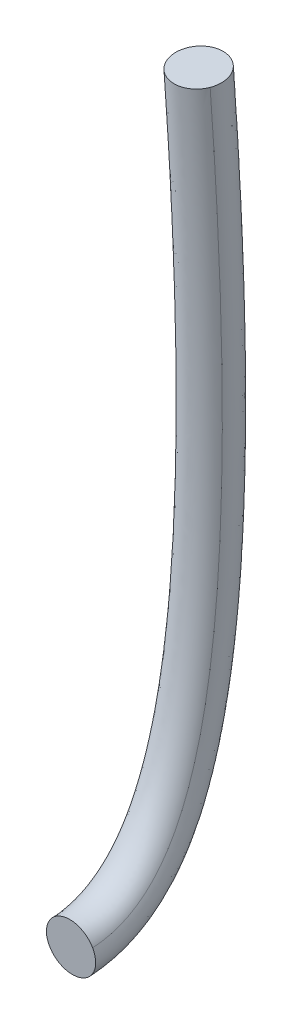
ISO-10303-21;
HEADER;
FILE_DESCRIPTION(('STEP AP214'),'2;1');
FILE_NAME('part.step','',(''),(''),'','','');
FILE_SCHEMA(('AUTOMOTIVE_DESIGN { 1 0 10303 214 1 1 1 1 }'));
ENDSEC;
DATA;
#1=APPLICATION_CONTEXT('core data for automotive mechanical design processes');
#2=APPLICATION_PROTOCOL_DEFINITION('international standard','automotive_design',2000,#1);
#3=PRODUCT_CONTEXT('',#1,'mechanical');
#4=PRODUCT('Part','Part','',(#3));
#5=PRODUCT_RELATED_PRODUCT_CATEGORY('part','',(#4));
#6=PRODUCT_DEFINITION_FORMATION('','',#4);
#7=PRODUCT_DEFINITION_CONTEXT('part definition',#1,'design');
#8=PRODUCT_DEFINITION('design','',#6,#7);
#9=PRODUCT_DEFINITION_SHAPE('','',#8);
#10=(LENGTH_UNIT() NAMED_UNIT(*) SI_UNIT(.MILLI.,.METRE.));
#11=(NAMED_UNIT(*) PLANE_ANGLE_UNIT() SI_UNIT($,.RADIAN.));
#12=(NAMED_UNIT(*) SI_UNIT($,.STERADIAN.) SOLID_ANGLE_UNIT());
#13=UNCERTAINTY_MEASURE_WITH_UNIT(LENGTH_MEASURE(1.E-05),#10,'distance_accuracy_value','');
#14=(GEOMETRIC_REPRESENTATION_CONTEXT(3) GLOBAL_UNCERTAINTY_ASSIGNED_CONTEXT((#13)) GLOBAL_UNIT_ASSIGNED_CONTEXT((#10,
#11,#12)) REPRESENTATION_CONTEXT('',''));
#15=CARTESIAN_POINT('',(0.,0.,0.));
#16=DIRECTION('',(0.,0.,1.));
#17=DIRECTION('',(1.,0.,0.));
#18=AXIS2_PLACEMENT_3D('',#15,#16,#17);
#19=CARTESIAN_POINT('',(19.2528947770719,-7.28816584731892,11.1726700992459));
#20=CARTESIAN_POINT('',(19.2528947770721,-7.2797998774545,11.0210211891771));
#21=CARTESIAN_POINT('',(19.2528947770723,-7.19252148432578,10.7546354346372));
#22=CARTESIAN_POINT('',(19.2528947770722,-6.82521930482318,10.4241681519348));
#23=CARTESIAN_POINT('',(19.2528947770718,-6.16593652603589,10.177071260801));
#24=CARTESIAN_POINT('',(19.2528947770714,-5.06042734487226,10.0061121195369));
#25=CARTESIAN_POINT('',(19.252894777071,-3.38310094063414,9.96220381229288));
#26=CARTESIAN_POINT('',(19.2528947770715,-1.84086867484102,10.0365189792936));
#27=CARTESIAN_POINT('',(19.2528947770719,-1.00711457101815,10.0974125590462));
#28=CARTESIAN_POINT('',(19.2237950641936,-7.22780268296444,11.1760001357999));
#29=CARTESIAN_POINT('',(19.2237950641938,-7.21998990173285,11.0343788082579));
#30=CARTESIAN_POINT('',(19.223795064194,-7.14066275815899,10.7916659537891));
#31=CARTESIAN_POINT('',(19.223795064194,-6.7971941131337,10.4792308251784));
#32=CARTESIAN_POINT('',(19.2237950641935,-6.152759146217,10.2363764894985));
#33=CARTESIAN_POINT('',(19.2237950641931,-5.05673501634292,10.0666901080208));
#34=CARTESIAN_POINT('',(19.2237950641927,-3.38440386039866,10.0226639554543));
#35=CARTESIAN_POINT('',(19.2237950641932,-1.84433189825577,10.0968820135693));
#36=CARTESIAN_POINT('',(19.2237950641937,-1.01151819422325,10.1577069108298));
#37=CARTESIAN_POINT('',(19.1072924405877,-7.13476627183315,11.1811326475433));
#38=CARTESIAN_POINT('',(19.1072924405879,-7.12780570260208,11.0549592624543));
#39=CARTESIAN_POINT('',(19.107292440588,-7.06073942932499,10.8487309055416));
#40=CARTESIAN_POINT('',(19.107292440588,-6.75399421305741,10.5640804815241));
#41=CARTESIAN_POINT('',(19.1072924405875,-6.13244240560903,10.3277713970417));
#42=CARTESIAN_POINT('',(19.1072924405871,-5.05103829187187,10.1600503561438));
#43=CARTESIAN_POINT('',(19.1072924405868,-3.38640664882599,10.1158458533863));
#44=CARTESIAN_POINT('',(19.1072924405872,-1.84967037715123,10.1899181738779));
#45=CARTESIAN_POINT('',(19.1072924405876,-1.01830540134462,10.2506372626664));
#46=CARTESIAN_POINT('',(18.8893955517359,-7.18477622453543,11.178373763506));
#47=CARTESIAN_POINT('',(18.8893955517361,-7.17735831437383,11.0439102154399));
#48=CARTESIAN_POINT('',(18.8893955517362,-7.10369074966388,10.8180740452729));
#49=CARTESIAN_POINT('',(18.8893955517362,-6.77722527891507,10.5185030039011));
#50=CARTESIAN_POINT('',(18.8893955517357,-6.14337573524482,10.2786640091069));
#51=CARTESIAN_POINT('',(18.8893955517353,-5.05411121634845,10.1098797636854));
#52=CARTESIAN_POINT('',(18.889395551735,-3.38534002015267,10.0657650624524));
#53=CARTESIAN_POINT('',(18.8893955517354,-1.8467995054108,10.1399084490463));
#54=CARTESIAN_POINT('',(18.8893955517359,-1.0146570672891,10.2006843201201));
#55=CARTESIAN_POINT('',(18.8250000000014,-7.31847179552639,11.1709982201049));
#56=CARTESIAN_POINT('',(18.8250000000016,-7.30982729388697,11.0143003987002));
#57=CARTESIAN_POINT('',(18.8250000000017,-7.21856827728348,10.7360254459493));
#58=CARTESIAN_POINT('',(18.8250000000017,-6.83927922884854,10.3964894765158));
#59=CARTESIAN_POINT('',(18.8250000000012,-6.17253911028429,10.14727495182));
#60=CARTESIAN_POINT('',(18.8250000000008,-5.06226966427635,9.9756840180992));
#61=CARTESIAN_POINT('',(18.8250000000005,-3.38243622395594,9.93184133465055));
#62=CARTESIAN_POINT('',(18.8250000000009,-1.83913128396928,10.00621299735));
#63=CARTESIAN_POINT('',(18.8250000000014,-1.00490368664486,10.0671411588984));
#64=CARTESIAN_POINT('',(18.825,-7.38568943191456,11.1672900449514));
#65=CARTESIAN_POINT('',(18.8250000000002,-7.37642950308164,10.9994364502612));
#66=CARTESIAN_POINT('',(18.8250000000004,-7.27630809150473,10.6948033284885));
#67=CARTESIAN_POINT('',(18.8250000000003,-6.87049433625223,10.3351987871578));
#68=CARTESIAN_POINT('',(18.8249999999999,-6.18722243949544,10.0812509721236));
#69=CARTESIAN_POINT('',(18.8249999999994,-5.06638957112934,9.90823752649242));
#70=CARTESIAN_POINT('',(18.8249999999991,-3.38099301503353,9.86452138941648));
#71=CARTESIAN_POINT('',(18.8249999999996,-1.83527381521949,9.93899557759439));
#72=CARTESIAN_POINT('',(18.825,-1.00000001490137,10.0000001490162));
#73=B_SPLINE_SURFACE_WITH_KNOTS('',3,3,((#19,#20,#21,#22,#23,#24,#25,#26,#27),(#28,#29,#30,#31,
#32,#33,#34,#35,#36),(#37,#38,#39,#40,#41,#42,#43,#44,#45),(#46,#47,#48,#49,#50,#51,#52,#53,
#54),(#55,#56,#57,#58,#59,#60,#61,#62,#63),(#64,#65,#66,#67,#68,#69,#70,#71,#72)),.UNSPECIFIED.,
.F.,.F.,.F.,(4,1,1,4),(4,1,1,1,1,1,4),(0.448798950512828,1.34639685153848,2.24399475256414,
3.14159265358979),(0.,0.142857142857143,0.285714285714286,0.428571428571429,0.571428571428571,
0.785714285714286,1.),.UNSPECIFIED.);
#74=CARTESIAN_POINT('',(18.825,-7.38568943191456,11.1672900449514));
#75=CARTESIAN_POINT('',(18.8250000000002,-7.37642950308164,10.9994364502612));
#76=CARTESIAN_POINT('',(18.8250000000004,-7.27630809150473,10.6948033284885));
#77=CARTESIAN_POINT('',(18.8250000000003,-6.87049433625223,10.3351987871578));
#78=CARTESIAN_POINT('',(18.8249999999999,-6.18722243949544,10.0812509721236));
#79=CARTESIAN_POINT('',(18.8249999999994,-5.06638957112934,9.90823752649242));
#80=CARTESIAN_POINT('',(18.8249999999991,-3.38099301503353,9.86452138941648));
#81=CARTESIAN_POINT('',(18.8249999999996,-1.83527381521949,9.93899557759439));
#82=CARTESIAN_POINT('',(18.825,-1.00000001490137,10.0000001490162));
#83=B_SPLINE_CURVE_WITH_KNOTS('',3,(#74,#75,#76,#77,#78,#79,#80,#81,#82),.UNSPECIFIED.,.F.,.F.,
(4,1,1,1,1,1,4),(0.,0.142857142857143,0.285714285714286,0.428571428571429,0.571428571428571,
0.785714285714286,1.),.UNSPECIFIED.);
#84=CARTESIAN_POINT('',(18.825,-7.38568943191456,11.1672900449514));
#85=VERTEX_POINT('',#84);
#86=CARTESIAN_POINT('',(18.825,-1.00000001490137,10.0000001490162));
#87=VERTEX_POINT('',#86);
#88=EDGE_CURVE('E11',#85,#87,#83,.T.);
#89=CARTESIAN_POINT('',(18.825,-7.38568943191456,11.1672900449514));
#90=CARTESIAN_POINT('',(18.8249787567478,-7.4110244281222,11.1658923968266));
#91=CARTESIAN_POINT('',(18.8294743987769,-7.4364319586651,11.1644907472219));
#92=CARTESIAN_POINT('',(18.8464204579757,-7.48437479441338,11.1618458992048));
#93=CARTESIAN_POINT('',(18.8588656010549,-7.50691199205775,11.1606025963928));
#94=CARTESIAN_POINT('',(18.8906822685011,-7.54639852309398,11.1584242547975));
#95=CARTESIAN_POINT('',(18.9100434814834,-7.5633561033884,11.1574887610597));
#96=CARTESIAN_POINT('',(18.9530898653422,-7.58996319255348,11.1560209357648));
#97=CARTESIAN_POINT('',(18.9767452734833,-7.59966078545054,11.1554859515708));
#98=CARTESIAN_POINT('',(19.026008330588,-7.61052234140669,11.1548867553764));
#99=CARTESIAN_POINT('',(19.0516208958479,-7.61166404968632,11.1548237710987));
#100=CARTESIAN_POINT('',(19.1018895627442,-7.60564143576732,11.1551560188315));
#101=CARTESIAN_POINT('',(19.126543976817,-7.5984630891467,11.1555520245231));
#102=CARTESIAN_POINT('',(19.1720071309013,-7.5762055509139,11.1567798994484));
#103=CARTESIAN_POINT('',(19.1928103781774,-7.56111519047087,11.1576123848296));
#104=CARTESIAN_POINT('',(19.2285080140848,-7.52495360470303,11.1596073001683));
#105=CARTESIAN_POINT('',(19.2433792744618,-7.50385950832155,11.1607709918465));
#106=CARTESIAN_POINT('',(19.2645564150039,-7.45823026818413,11.1632882064296));
#107=CARTESIAN_POINT('',(19.2710307914706,-7.43377407402945,11.1646373739455));
#108=CARTESIAN_POINT('',(19.2747934378822,-7.39652839130321,11.1666920953354));
#109=CARTESIAN_POINT('',(19.2750377182534,-7.38393505353785,11.1673868282168));
#110=CARTESIAN_POINT('',(19.2735026038081,-7.35886043800239,11.1687701119993));
#111=CARTESIAN_POINT('',(19.2717242289816,-7.3463791069471,11.16945866584));
#112=CARTESIAN_POINT('',(19.2660059691309,-7.3213599391629,11.1708388907531));
#113=CARTESIAN_POINT('',(19.2619783001472,-7.30884181415171,11.171529474395));
#114=CARTESIAN_POINT('',(19.2516664025096,-7.28477273708271,11.172857285939));
#115=CARTESIAN_POINT('',(19.2453836009585,-7.27322117904578,11.1734945472709));
#116=CARTESIAN_POINT('',(19.2313883384449,-7.25221095221332,11.1746536121428));
#117=CARTESIAN_POINT('',(19.2238106369282,-7.24266161722765,11.1751804174373));
#118=CARTESIAN_POINT('',(19.2072451838243,-7.22485204436136,11.1761629127933));
#119=CARTESIAN_POINT('',(19.1982555374233,-7.21659356895037,11.1766185056253));
#120=CARTESIAN_POINT('',(19.1785041368001,-7.20109314765079,11.1774736127106));
#121=CARTESIAN_POINT('',(19.1676667107909,-7.19394709210453,11.1778678370102));
#122=CARTESIAN_POINT('',(19.1449578305796,-7.18157263320829,11.1785504950667));
#123=CARTESIAN_POINT('',(19.1330878787507,-7.17634149946488,11.1788390794503));
#124=CARTESIAN_POINT('',(19.1086522957359,-7.16811106687002,11.1792931252527));
#125=CARTESIAN_POINT('',(19.0960903561247,-7.16510096367396,11.1794591827115));
#126=CARTESIAN_POINT('',(19.0706264810286,-7.16139413507037,11.1796636762115));
#127=CARTESIAN_POINT('',(19.0577243364927,-7.16069886713684,11.1797020318486));
#128=CARTESIAN_POINT('',(19.032708522642,-7.16145215474715,11.1796604754573));
#129=CARTESIAN_POINT('',(19.0205907697264,-7.16278407900055,11.1795869975922));
#130=CARTESIAN_POINT('',(18.9967022512216,-7.16730473150309,11.1793376081136));
#131=CARTESIAN_POINT('',(18.9849316667599,-7.17049441160167,11.1791616439898));
#132=CARTESIAN_POINT('',(18.9611226041558,-7.17899031168153,11.1786929532223));
#133=CARTESIAN_POINT('',(18.9491360266979,-7.18444342949774,11.17839212271));
#134=CARTESIAN_POINT('',(18.9263300332847,-7.1973668552695,11.1776791799628));
#135=CARTESIAN_POINT('',(18.9155089826471,-7.20483428515942,11.1772672265013));
#136=CARTESIAN_POINT('',(18.8864572704284,-7.22919708711439,11.1759232111247));
#137=CARTESIAN_POINT('',(18.8702427541511,-7.24855550567924,11.1748552710632));
#138=CARTESIAN_POINT('',(18.8446445865298,-7.29144982964396,11.172488932779));
#139=CARTESIAN_POINT('',(18.8353041487466,-7.31501102506774,11.1711891393892));
#140=CARTESIAN_POINT('',(18.8267288110664,-7.35460651785567,11.1690047867336));
#141=CARTESIAN_POINT('',(18.8250130428881,-7.37013430329071,11.1681481700592));
#142=CARTESIAN_POINT('',(18.825,-7.38568943191456,11.1672900449514));
#143=B_SPLINE_CURVE_WITH_KNOTS('',3,(#89,#90,#91,#92,#93,#94,#95,#96,#97,#98,#99,#100,#101,#102,
#103,#104,#105,#106,#107,#108,#109,#110,#111,#112,#113,#114,#115,#116,#117,#118,#119,#120,#121,
#122,#123,#124,#125,#126,#127,#128,#129,#130,#131,#132,#133,#134,#135,#136,#137,#138,#139,#140,
#141,#142),.UNSPECIFIED.,.T.,.F.,(4,2,2,2,2,2,2,2,2,2,2,2,2,2,2,2,2,2,2,2,2,2,2,2,2,2,4),(0.,
0.0759477572260482,0.151845179230969,0.227629912483941,0.302908159746506,0.37838214611577,
0.453983537927542,0.529691939361132,0.605692701206692,0.680143511907215,0.717867458128475,
0.755572389248816,0.794863505805709,0.834129801699198,0.870581484714244,0.907082510145995,
0.945866587724507,0.984595147573542,1.02313404487511,1.0616972025765,1.09812401063087,
1.13456949895318,1.17388509927665,1.2131448199994,1.28747563072116,1.36226981768641,
1.40890006474315),.UNSPECIFIED.);
#144=CARTESIAN_POINT('',(19.2528947770719,-7.28816584731892,11.1726700992458));
#145=VERTEX_POINT('',#144);
#146=EDGE_CURVE('E44',#145,#85,#143,.T.);
#147=CARTESIAN_POINT('',(19.2528947770719,-7.28816584731892,11.1726700992459));
#148=CARTESIAN_POINT('',(19.2528947770721,-7.2797998774545,11.0210211891771));
#149=CARTESIAN_POINT('',(19.2528947770723,-7.19252148432578,10.7546354346372));
#150=CARTESIAN_POINT('',(19.2528947770722,-6.82521930482318,10.4241681519348));
#151=CARTESIAN_POINT('',(19.2528947770718,-6.16593652603589,10.177071260801));
#152=CARTESIAN_POINT('',(19.2528947770714,-5.06042734487226,10.0061121195369));
#153=CARTESIAN_POINT('',(19.252894777071,-3.38310094063414,9.96220381229288));
#154=CARTESIAN_POINT('',(19.2528947770715,-1.84086867484102,10.0365189792936));
#155=CARTESIAN_POINT('',(19.2528947770719,-1.00711457101815,10.0974125590462));
#156=B_SPLINE_CURVE_WITH_KNOTS('',3,(#147,#148,#149,#150,#151,#152,#153,#154,#155),
.UNSPECIFIED.,.F.,.F.,(4,1,1,1,1,1,4),(0.,0.142857142857143,0.285714285714286,0.428571428571429,
0.571428571428571,0.785714285714286,1.),.UNSPECIFIED.);
#157=CARTESIAN_POINT('',(19.2528947770719,-1.00711457101815,10.0974125590462));
#158=VERTEX_POINT('',#157);
#159=EDGE_CURVE('E28',#145,#158,#156,.T.);
#160=CARTESIAN_POINT('',(18.825,-1.00000001490137,10.0000001490162));
#161=CARTESIAN_POINT('',(18.8250109181913,-1.00092580472432,10.0126760512591));
#162=CARTESIAN_POINT('',(18.8261530321641,-1.00185187551814,10.0253558005514));
#163=CARTESIAN_POINT('',(18.8305838852544,-1.00367791150831,10.0503578616343));
#164=CARTESIAN_POINT('',(18.8338777244189,-1.00457780936263,10.0626792513787));
#165=CARTESIAN_POINT('',(18.8424215830512,-1.00632381290804,10.0865855092663));
#166=CARTESIAN_POINT('',(18.8476658999324,-1.0071700670765,10.0981724103601));
#167=CARTESIAN_POINT('',(18.8599671540895,-1.00878875711127,10.1203354933121));
#168=CARTESIAN_POINT('',(18.867022804598,-1.00956124484879,10.1309123853903));
#169=CARTESIAN_POINT('',(18.8830473043434,-1.01103191238999,10.1510487462811));
#170=CARTESIAN_POINT('',(18.8920670989589,-1.01172717584948,10.1605682845467));
#171=CARTESIAN_POINT('',(18.911714688226,-1.01298381844444,10.1777742186507));
#172=CARTESIAN_POINT('',(18.9223414033252,-1.01354528681795,10.1854618363352));
#173=CARTESIAN_POINT('',(18.9440022455505,-1.01448718471638,10.1983582901385));
#174=CARTESIAN_POINT('',(18.9549563886812,-1.01487750290831,10.2037025217575));
#175=CARTESIAN_POINT('',(18.977580422782,-1.01552893035078,10.2126218578468));
#176=CARTESIAN_POINT('',(18.989251272514,-1.01578986209047,10.2161945318407));
#177=CARTESIAN_POINT('',(19.0137377764477,-1.01618887948422,10.2216578728182));
#178=CARTESIAN_POINT('',(19.0265797390324,-1.01631844731236,10.2234319138397));
#179=CARTESIAN_POINT('',(19.0523679195356,-1.01641934343637,10.2248133822603));
#180=CARTESIAN_POINT('',(19.0653139645743,-1.01639089498417,10.2244238664219));
#181=CARTESIAN_POINT('',(19.0908889662697,-1.01616586051969,10.221342697454));
#182=CARTESIAN_POINT('',(19.1035188910104,-1.0159698759265,10.2186592789469));
#183=CARTESIAN_POINT('',(19.1280867734604,-1.01541491231418,10.211060724368));
#184=CARTESIAN_POINT('',(19.1400243132546,-1.01505583598602,10.2061442559422));
#185=CARTESIAN_POINT('',(19.1622666549418,-1.0142213401306,10.194718349518));
#186=CARTESIAN_POINT('',(19.1726251971514,-1.01375343060836,10.1883117384109));
#187=CARTESIAN_POINT('',(19.1922303876475,-1.01270643326614,10.1739762643867));
#188=CARTESIAN_POINT('',(19.2014763989373,-1.01212728224114,10.1660465360675));
#189=CARTESIAN_POINT('',(19.2193114355615,-1.01082047262772,10.1481537157974));
#190=CARTESIAN_POINT('',(19.2277885793571,-1.01008463613109,10.1380786520335));
#191=CARTESIAN_POINT('',(19.2428204220228,-1.00851730780645,10.1166188129499));
#192=CARTESIAN_POINT('',(19.2493779379054,-1.00768595866319,10.1052359912679));
#193=CARTESIAN_POINT('',(19.2651265856202,-1.00516543423691,10.0707250035293));
#194=CARTESIAN_POINT('',(19.2714235164173,-1.00337433585107,10.0462013076714));
#195=CARTESIAN_POINT('',(19.2748745091724,-1.00065795426975,10.0090086463074));
#196=CARTESIAN_POINT('',(19.2750136793517,-0.999743674224281,9.99649033578837));
#197=CARTESIAN_POINT('',(19.2732931621707,-0.997924199166312,9.971578106904));
#198=CARTESIAN_POINT('',(19.2714347837034,-0.997018998596547,9.95918411244858));
#199=CARTESIAN_POINT('',(19.2655673123817,-0.995200045065652,9.93427902430614));
#200=CARTESIAN_POINT('',(19.2614593084531,-0.99428796552326,9.92179084304678));
#201=CARTESIAN_POINT('',(19.2510066694789,-0.992534302526887,9.89777971205586));
#202=CARTESIAN_POINT('',(19.2446623413411,-0.991692709419112,9.88625663014469));
#203=CARTESIAN_POINT('',(19.2305120983662,-0.990157287673612,9.86523365552886));
#204=CARTESIAN_POINT('',(19.222828817833,-0.989457396335862,9.85565075241415));
#205=CARTESIAN_POINT('',(19.2060267853957,-0.988155652582737,9.83782729383777));
#206=CARTESIAN_POINT('',(19.1969074816671,-0.987553838037252,9.82958725689015));
#207=CARTESIAN_POINT('',(19.1770400072905,-0.98644005386125,9.81433733840483));
#208=CARTESIAN_POINT('',(19.1662383063661,-0.985933119465361,9.8073963992343));
#209=CARTESIAN_POINT('',(19.1435902130887,-0.98506418164547,9.79549891387976));
#210=CARTESIAN_POINT('',(19.1317442027048,-0.984702125496621,9.79054164578782));
#211=CARTESIAN_POINT('',(19.1076328991134,-0.984135806738354,9.78278761669829));
#212=CARTESIAN_POINT('',(19.0953810271801,-0.983928485637856,9.77994897888053));
#213=CARTESIAN_POINT('',(19.0705750372595,-0.983661571953099,9.77629440017247));
#214=CARTESIAN_POINT('',(19.0580208206622,-0.983602028243818,9.77547912847772));
#215=CARTESIAN_POINT('',(19.0326191546597,-0.983634266928398,9.77592054012885));
#216=CARTESIAN_POINT('',(19.0197724836649,-0.983729987601742,9.77723114634632));
#217=CARTESIAN_POINT('',(18.9945141133807,-0.984084845038588,9.78208984976718));
#218=CARTESIAN_POINT('',(18.9821022922265,-0.984343935625353,9.78563731471932));
#219=CARTESIAN_POINT('',(18.9584360903222,-0.985002478628251,9.79465407697));
#220=CARTESIAN_POINT('',(18.947158114269,-0.985397470813508,9.80006230484525));
#221=CARTESIAN_POINT('',(18.9256313654289,-0.986315651723881,9.81263402595602));
#222=CARTESIAN_POINT('',(18.9153827832398,-0.986838864128185,9.81979784340666));
#223=CARTESIAN_POINT('',(18.8959603266734,-0.988016643027987,9.83592397682017));
#224=CARTESIAN_POINT('',(18.886820583608,-0.988674222902751,9.84492755193282));
#225=CARTESIAN_POINT('',(18.8702627567085,-0.990094317822845,9.86437147315188));
#226=CARTESIAN_POINT('',(18.862844587482,-0.990856827660514,9.87481174795505));
#227=CARTESIAN_POINT('',(18.8437497796507,-0.993226332368481,9.90725497567021));
#228=CARTESIAN_POINT('',(18.8346660855067,-0.994950878133374,9.93086743390569));
#229=CARTESIAN_POINT('',(18.8265627659187,-0.997806156267838,9.96996186507315));
#230=CARTESIAN_POINT('',(18.8249870611688,-0.998902888287822,9.98497830565976));
#231=CARTESIAN_POINT('',(18.825,-1.00000001490137,10.0000001490162));
#232=B_SPLINE_CURVE_WITH_KNOTS('',3,(#160,#161,#162,#163,#164,#165,#166,#167,#168,#169,#170,
#171,#172,#173,#174,#175,#176,#177,#178,#179,#180,#181,#182,#183,#184,#185,#186,#187,#188,#189,
#190,#191,#192,#193,#194,#195,#196,#197,#198,#199,#200,#201,#202,#203,#204,#205,#206,#207,#208,
#209,#210,#211,#212,#213,#214,#215,#216,#217,#218,#219,#220,#221,#222,#223,#224,#225,#226,#227,
#228,#229,#230,#231),.UNSPECIFIED.,.T.,.F.,(4,2,2,2,2,2,2,2,2,2,2,2,2,2,2,2,2,2,2,2,2,2,2,2,2,2,
2,2,2,2,2,2,2,2,2,4),(0.,0.0380916197498575,0.0762738539433418,0.114345321720433,
0.152389818094962,0.191573083902914,0.230730141825373,0.267158744038735,0.303637186890244,
0.3423533744087,0.381014876024783,0.419538171104157,0.458084481444926,0.494504582417647,
0.53094543804501,0.570304089126705,0.609604689322635,0.68407308037606,0.721620800479734,
0.759143932442461,0.798467384978698,0.837785442953745,0.874533630196591,0.911295973380788,
0.94965442616786,0.987998906623312,1.02556379301653,1.06314110173262,1.10168654970401,
1.14022110763119,1.17759562683259,1.21497705341574,1.25331315977251,1.29164736419894,
1.3661782664088,1.41131953794219),.UNSPECIFIED.);
#233=EDGE_CURVE('E47',#87,#158,#232,.T.);
#234=ORIENTED_EDGE('',*,*,#88,.F.);
#235=ORIENTED_EDGE('',*,*,#146,.F.);
#236=ORIENTED_EDGE('',*,*,#159,.T.);
#237=ORIENTED_EDGE('',*,*,#233,.F.);
#238=EDGE_LOOP('',(#234,#235,#236,#237));
#239=FACE_BOUND('',#238,.T.);
#240=ADVANCED_FACE('F16',(#239),#73,.F.);
#241=CARTESIAN_POINT('',(19.05,-1.00000001490116,10.0000001490116));
#242=DIRECTION('',(-5.32623886368089E-13,-0.997343536648528,-0.0728414024124084));
#243=DIRECTION('',(0.,0.0728414024124084,-0.997343536648528));
#244=AXIS2_PLACEMENT_3D('',#241,#242,#243);
#245=PLANE('',#244);
#246=ORIENTED_EDGE('',*,*,#233,.T.);
#247=EDGE_CURVE('E79',#158,#87,#232,.T.);
#248=ORIENTED_EDGE('',*,*,#247,.T.);
#249=EDGE_LOOP('',(#246,#248));
#250=FACE_BOUND('',#249,.T.);
#251=ADVANCED_FACE('F71',(#250),#245,.F.);
#252=CARTESIAN_POINT('',(19.05,-7.38568943191911,11.1672900449514));
#253=DIRECTION('',(-1.11249196396045E-12,-0.0550829445172842,0.998481782118886));
#254=DIRECTION('',(0.,-0.998481782118886,-0.0550829445172842));
#255=AXIS2_PLACEMENT_3D('',#252,#253,#254);
#256=PLANE('',#255);
#257=EDGE_CURVE('E51',#85,#145,#143,.T.);
#258=ORIENTED_EDGE('',*,*,#257,.T.);
#259=ORIENTED_EDGE('',*,*,#146,.T.);
#260=EDGE_LOOP('',(#258,#259));
#261=FACE_BOUND('',#260,.T.);
#262=ADVANCED_FACE('F50',(#261),#256,.T.);
#263=CARTESIAN_POINT('',(18.825,-7.38568943191456,11.1672900449514));
#264=CARTESIAN_POINT('',(18.8250000000002,-7.37642950308164,10.9994364502612));
#265=CARTESIAN_POINT('',(18.8250000000004,-7.27630809150473,10.6948033284885));
#266=CARTESIAN_POINT('',(18.8250000000003,-6.87049433625223,10.3351987871578));
#267=CARTESIAN_POINT('',(18.8249999999999,-6.18722243949544,10.0812509721236));
#268=CARTESIAN_POINT('',(18.8249999999994,-5.06638957112934,9.90823752649242));
#269=CARTESIAN_POINT('',(18.8249999999991,-3.38099301503353,9.86452138941648));
#270=CARTESIAN_POINT('',(18.8249999999996,-1.83527381521949,9.93899557759439));
#271=CARTESIAN_POINT('',(18.825,-1.00000001490137,10.0000001490162));
#272=CARTESIAN_POINT('',(18.824999999999,-7.43610265920569,11.1645089135862));
#273=CARTESIAN_POINT('',(18.8249999999992,-7.42638032085317,10.9882732782254));
#274=CARTESIAN_POINT('',(18.8249999999994,-7.31962408702581,10.6638673484241));
#275=CARTESIAN_POINT('',(18.8249999999993,-6.89389471443269,10.2891951178612));
#276=CARTESIAN_POINT('',(18.8249999999989,-6.19822099355093,10.031710362897));
#277=CARTESIAN_POINT('',(18.8249999999984,-5.06946745479596,9.85763761718624));
#278=CARTESIAN_POINT('',(18.8249999999981,-3.37989948728313,9.81402318338897));
#279=CARTESIAN_POINT('',(18.8249999999985,-1.83238214013707,9.88858240859414));
#280=CARTESIAN_POINT('',(18.824999999999,-0.996322261093759,9.94964439160444));
#281=CARTESIAN_POINT('',(18.8485400055215,-7.50309952556123,11.1608129175867));
#282=CARTESIAN_POINT('',(18.8485400055217,-7.49276306390652,10.9734451444184));
#283=CARTESIAN_POINT('',(18.8485400055219,-7.37718378014028,10.6227640417024));
#284=CARTESIAN_POINT('',(18.8485400055218,-6.92499793484894,10.2280752505993));
#285=CARTESIAN_POINT('',(18.8485400055214,-6.21284417609724,9.96588388967307));
#286=CARTESIAN_POINT('',(18.8485400055209,-5.07356353089318,9.79039978808487));
#287=CARTESIAN_POINT('',(18.8485400055206,-3.37845151033442,9.74691729323154));
#288=CARTESIAN_POINT('',(18.848540005521,-1.82853856047197,9.82158566908642));
#289=CARTESIAN_POINT('',(18.8485400055215,-0.99143469500096,9.88272390008219));
#290=CARTESIAN_POINT('',(18.9205194471234,-7.57470788698367,11.1568625206243));
#291=CARTESIAN_POINT('',(18.9205194471236,-7.56371567923322,10.9576081183723));
#292=CARTESIAN_POINT('',(18.9205194471238,-7.43869679164389,10.5788465131658));
#293=CARTESIAN_POINT('',(18.9205194471237,-6.95825049758241,10.1627759529035));
#294=CARTESIAN_POINT('',(18.9205194471233,-6.22848466536348,9.89554395904946));
#295=CARTESIAN_POINT('',(18.9205194471228,-5.07795085215862,9.71854549718993));
#296=CARTESIAN_POINT('',(18.9205194471225,-3.37691245814788,9.67519877475127));
#297=CARTESIAN_POINT('',(18.920519447123,-1.82442931945998,9.74997752372637));
#298=CARTESIAN_POINT('',(18.9205194471234,-0.986210710383677,9.81119717048768));
#299=CARTESIAN_POINT('',(19.0138357597497,-7.61993822778265,11.1543673120013));
#300=CARTESIAN_POINT('',(19.0138357597499,-7.60853094346161,10.9475888676423));
#301=CARTESIAN_POINT('',(19.0138357597501,-7.47756229327091,10.551086229729));
#302=CARTESIAN_POINT('',(19.01383575975,-6.97924243308521,10.121493059137));
#303=CARTESIAN_POINT('',(19.0138357597496,-6.23834904846096,9.85109095702179));
#304=CARTESIAN_POINT('',(19.0138357597491,-5.0807093403212,9.67314396580801));
#305=CARTESIAN_POINT('',(19.0138357597488,-3.37592861735485,9.6298901623817));
#306=CARTESIAN_POINT('',(19.0138357597492,-1.82183528291435,9.70474720958943));
#307=CARTESIAN_POINT('',(19.0138357597497,-0.982911059339119,9.76601839120084));
#308=CARTESIAN_POINT('',(19.1550527878206,-7.60399758440968,11.1552467046856));
#309=CARTESIAN_POINT('',(19.1550527878208,-7.59273678314318,10.9511235406969));
#310=CARTESIAN_POINT('',(19.1550527878209,-7.46386221786401,10.5608743992808));
#311=CARTESIAN_POINT('',(19.1550527878209,-6.97184675782698,10.1360508455));
#312=CARTESIAN_POINT('',(19.1550527878205,-6.23487578516841,9.86676294082047));
#313=CARTESIAN_POINT('',(19.15505278782,-5.07973998131121,9.68914846564887));
#314=CARTESIAN_POINT('',(19.1550527878197,-3.3762779600182,9.6458603231281));
#315=CARTESIAN_POINT('',(19.1550527878201,-1.822749171613,9.72068786797136));
#316=CARTESIAN_POINT('',(19.1550527878206,-0.984073963700032,9.78194086261971));
#317=CARTESIAN_POINT('',(19.2819036893688,-7.47839322717422,11.1621758825282));
#318=CARTESIAN_POINT('',(19.281903689369,-7.46828359396251,10.9789198007355));
#319=CARTESIAN_POINT('',(19.2819036893692,-7.35595283934659,10.637929931237));
#320=CARTESIAN_POINT('',(19.2819036893691,-6.91353275485908,10.2506295716413));
#321=CARTESIAN_POINT('',(19.2819036893687,-6.20745758718895,9.99016827576254));
#322=CARTESIAN_POINT('',(19.2819036893683,-5.07205818934212,9.81520138846685));
#323=CARTESIAN_POINT('',(19.2819036893679,-3.37899024156771,9.77166732875676));
#324=CARTESIAN_POINT('',(19.2819036893684,-1.82995533850818,9.84629196532311));
#325=CARTESIAN_POINT('',(19.2819036893688,-0.993237072826361,9.90740203387697));
#326=CARTESIAN_POINT('',(19.2819944899501,-7.3485290116734,11.1693400626918));
#327=CARTESIAN_POINT('',(19.2819944899503,-7.33960985317615,11.0076635700964));
#328=CARTESIAN_POINT('',(19.2819944899505,-7.24438021049257,10.7176049154853));
#329=CARTESIAN_POINT('',(19.2819944899505,-6.85324449651265,10.3691054786912));
#330=CARTESIAN_POINT('',(19.28199448995,-6.17911390585479,10.1177660321035));
#331=CARTESIAN_POINT('',(19.2819944899496,-5.0641196734016,9.94553413105295));
#332=CARTESIAN_POINT('',(19.2819944899492,-3.38179802086962,9.90174366913142));
#333=CARTESIAN_POINT('',(19.2819944899497,-1.83740545142627,9.97615594501795));
#334=CARTESIAN_POINT('',(19.2819944899502,-1.00271094781304,10.0371182072626));
#335=CARTESIAN_POINT('',(19.2528947770719,-7.28816584731892,11.1726700992459));
#336=CARTESIAN_POINT('',(19.2528947770721,-7.2797998774545,11.0210211891771));
#337=CARTESIAN_POINT('',(19.2528947770723,-7.19252148432578,10.7546354346372));
#338=CARTESIAN_POINT('',(19.2528947770722,-6.82521930482318,10.4241681519348));
#339=CARTESIAN_POINT('',(19.2528947770718,-6.16593652603589,10.177071260801));
#340=CARTESIAN_POINT('',(19.2528947770714,-5.06042734487226,10.0061121195369));
#341=CARTESIAN_POINT('',(19.252894777071,-3.38310094063414,9.96220381229288));
#342=CARTESIAN_POINT('',(19.2528947770715,-1.84086867484102,10.0365189792936));
#343=CARTESIAN_POINT('',(19.2528947770719,-1.00711457101815,10.0974125590462));
#344=B_SPLINE_SURFACE_WITH_KNOTS('',3,3,((#263,#264,#265,#266,#267,#268,#269,#270,#271),(#272,
#273,#274,#275,#276,#277,#278,#279,#280),(#281,#282,#283,#284,#285,#286,#287,#288,#289),(#290,
#291,#292,#293,#294,#295,#296,#297,#298),(#299,#300,#301,#302,#303,#304,#305,#306,#307),(#308,
#309,#310,#311,#312,#313,#314,#315,#316),(#317,#318,#319,#320,#321,#322,#323,#324,#325),(#326,
#327,#328,#329,#330,#331,#332,#333,#334),(#335,#336,#337,#338,#339,#340,#341,#342,#343)),
.UNSPECIFIED.,.F.,.F.,.F.,(4,1,1,1,1,1,4),(4,1,1,1,1,1,4),(-3.14159265358979,-2.46839422782055,
-2.24399475256414,-1.79519580205131,-1.12199737628207,-0.448798950512828,0.448798950512828),(0.,
0.142857142857143,0.285714285714286,0.428571428571429,0.571428571428571,0.785714285714286,1.),.UNSPECIFIED.);
#345=ORIENTED_EDGE('',*,*,#257,.F.);
#346=ORIENTED_EDGE('',*,*,#88,.T.);
#347=ORIENTED_EDGE('',*,*,#247,.F.);
#348=ORIENTED_EDGE('',*,*,#159,.F.);
#349=EDGE_LOOP('',(#345,#346,#347,#348));
#350=FACE_BOUND('',#349,.T.);
#351=ADVANCED_FACE('F53',(#350),#344,.F.);
#352=CLOSED_SHELL('',(#240,#251,#262,#351));
#353=MANIFOLD_SOLID_BREP('B1',#352);
#354=ADVANCED_BREP_SHAPE_REPRESENTATION('',(#18,#353),#14);
#355=SHAPE_DEFINITION_REPRESENTATION(#9,#354);
ENDSEC;
END-ISO-10303-21;
